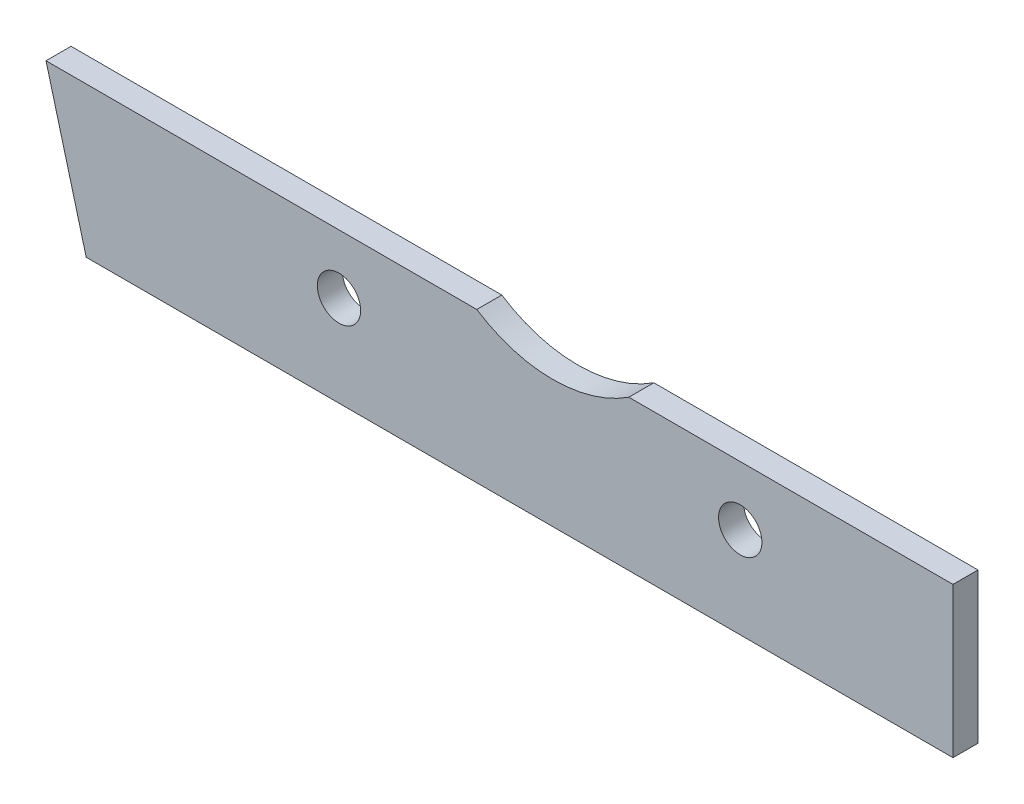
ISO-10303-21;
HEADER;
FILE_DESCRIPTION(('STEP AP214'),'2;1');
FILE_NAME('part.step','',(''),(''),'','','');
FILE_SCHEMA(('AUTOMOTIVE_DESIGN { 1 0 10303 214 1 1 1 1 }'));
ENDSEC;
DATA;
#1=APPLICATION_CONTEXT('core data for automotive mechanical design processes');
#2=APPLICATION_PROTOCOL_DEFINITION('international standard','automotive_design',2000,#1);
#3=PRODUCT_CONTEXT('',#1,'mechanical');
#4=PRODUCT('Part','Part','',(#3));
#5=PRODUCT_RELATED_PRODUCT_CATEGORY('part','',(#4));
#6=PRODUCT_DEFINITION_FORMATION('','',#4);
#7=PRODUCT_DEFINITION_CONTEXT('part definition',#1,'design');
#8=PRODUCT_DEFINITION('design','',#6,#7);
#9=PRODUCT_DEFINITION_SHAPE('','',#8);
#10=(LENGTH_UNIT() NAMED_UNIT(*) SI_UNIT(.MILLI.,.METRE.));
#11=(NAMED_UNIT(*) PLANE_ANGLE_UNIT() SI_UNIT($,.RADIAN.));
#12=(NAMED_UNIT(*) SI_UNIT($,.STERADIAN.) SOLID_ANGLE_UNIT());
#13=UNCERTAINTY_MEASURE_WITH_UNIT(LENGTH_MEASURE(1.E-05),#10,'distance_accuracy_value','');
#14=(GEOMETRIC_REPRESENTATION_CONTEXT(3) GLOBAL_UNCERTAINTY_ASSIGNED_CONTEXT((#13)) GLOBAL_UNIT_ASSIGNED_CONTEXT((#10,
#11,#12)) REPRESENTATION_CONTEXT('',''));
#15=CARTESIAN_POINT('',(0.,0.,0.));
#16=DIRECTION('',(0.,0.,1.));
#17=DIRECTION('',(1.,0.,0.));
#18=AXIS2_PLACEMENT_3D('',#15,#16,#17);
#19=CARTESIAN_POINT('',(-94.8284833684511,-355.15,-3.175));
#20=DIRECTION('',(1.,0.,0.));
#21=DIRECTION('',(0.,0.,-1.));
#22=AXIS2_PLACEMENT_3D('',#19,#20,#21);
#23=PLANE('',#22);
#24=DIRECTION('',(0.,1.,0.));
#25=VECTOR('',#24,1.);
#26=CARTESIAN_POINT('',(-94.8284833684511,-355.15,0.));
#27=LINE('',#26,#25);
#28=CARTESIAN_POINT('',(-94.8284833684511,-355.15,0.));
#29=VERTEX_POINT('',#28);
#30=CARTESIAN_POINT('',(-94.8284833684511,-336.1,0.));
#31=VERTEX_POINT('',#30);
#32=EDGE_CURVE('E133',#29,#31,#27,.T.);
#33=ORIENTED_EDGE('',*,*,#32,.F.);
#34=DIRECTION('',(0.,0.,1.));
#35=VECTOR('',#34,1.);
#36=CARTESIAN_POINT('',(-94.8284833684511,-355.15,-3.175));
#37=LINE('',#36,#35);
#38=CARTESIAN_POINT('',(-94.8284833684511,-355.15,-3.175));
#39=VERTEX_POINT('',#38);
#40=EDGE_CURVE('E11',#39,#29,#37,.T.);
#41=ORIENTED_EDGE('',*,*,#40,.F.);
#42=DIRECTION('',(0.,1.,0.));
#43=VECTOR('',#42,1.);
#44=CARTESIAN_POINT('',(-94.8284833684511,-355.15,-3.175));
#45=LINE('',#44,#43);
#46=CARTESIAN_POINT('',(-94.8284833684511,-336.1,-3.175));
#47=VERTEX_POINT('',#46);
#48=EDGE_CURVE('E154',#39,#47,#45,.T.);
#49=ORIENTED_EDGE('',*,*,#48,.T.);
#50=DIRECTION('',(0.,0.,1.));
#51=VECTOR('',#50,1.);
#52=CARTESIAN_POINT('',(-94.8284833684511,-336.1,-3.175));
#53=LINE('',#52,#51);
#54=EDGE_CURVE('E44',#47,#31,#53,.T.);
#55=ORIENTED_EDGE('',*,*,#54,.T.);
#56=EDGE_LOOP('',(#33,#41,#49,#55));
#57=FACE_BOUND('',#56,.T.);
#58=ADVANCED_FACE('F41',(#57),#23,.T.);
#59=CARTESIAN_POINT('',(-94.8284833684511,-355.15,-3.175));
#60=DIRECTION('',(0.,-1.,0.));
#61=DIRECTION('',(0.,0.,-1.));
#62=AXIS2_PLACEMENT_3D('',#59,#60,#61);
#63=PLANE('',#62);
#64=DIRECTION('',(1.,0.,0.));
#65=VECTOR('',#64,1.);
#66=CARTESIAN_POINT('',(-94.8284833684511,-355.15,0.));
#67=LINE('',#66,#65);
#68=CARTESIAN_POINT('',(-204.828483368451,-355.15,0.));
#69=VERTEX_POINT('',#68);
#70=EDGE_CURVE('E151',#69,#29,#67,.T.);
#71=ORIENTED_EDGE('',*,*,#70,.F.);
#72=DIRECTION('',(0.,0.,1.));
#73=VECTOR('',#72,1.);
#74=CARTESIAN_POINT('',(-204.828483368451,-355.15,-3.175));
#75=LINE('',#74,#73);
#76=CARTESIAN_POINT('',(-204.828483368451,-355.15,-3.175));
#77=VERTEX_POINT('',#76);
#78=EDGE_CURVE('E51',#77,#69,#75,.T.);
#79=ORIENTED_EDGE('',*,*,#78,.F.);
#80=DIRECTION('',(1.,0.,0.));
#81=VECTOR('',#80,1.);
#82=CARTESIAN_POINT('',(-94.8284833684511,-355.15,-3.175));
#83=LINE('',#82,#81);
#84=EDGE_CURVE('E118',#77,#39,#83,.T.);
#85=ORIENTED_EDGE('',*,*,#84,.T.);
#86=ORIENTED_EDGE('',*,*,#40,.T.);
#87=EDGE_LOOP('',(#71,#79,#85,#86));
#88=FACE_BOUND('',#87,.T.);
#89=ADVANCED_FACE('F168',(#88),#63,.T.);
#90=CARTESIAN_POINT('',(-204.828483368451,-355.15,-3.175));
#91=DIRECTION('',(-0.965925826289069,-0.258819045102518,0.));
#92=DIRECTION('',(0.258819045102518,-0.965925826289069,0.));
#93=AXIS2_PLACEMENT_3D('',#90,#91,#92);
#94=PLANE('',#93);
#95=DIRECTION('',(0.258819045102518,-0.965925826289069,0.));
#96=VECTOR('',#95,1.);
#97=CARTESIAN_POINT('',(-204.828483368451,-355.15,0.));
#98=LINE('',#97,#96);
#99=CARTESIAN_POINT('',(-209.932915484264,-336.1,0.));
#100=VERTEX_POINT('',#99);
#101=EDGE_CURVE('E104',#100,#69,#98,.T.);
#102=ORIENTED_EDGE('',*,*,#101,.F.);
#103=DIRECTION('',(0.,0.,1.));
#104=VECTOR('',#103,1.);
#105=CARTESIAN_POINT('',(-209.932915484264,-336.1,-3.175));
#106=LINE('',#105,#104);
#107=CARTESIAN_POINT('',(-209.932915484264,-336.1,-3.175));
#108=VERTEX_POINT('',#107);
#109=EDGE_CURVE('E99',#108,#100,#106,.T.);
#110=ORIENTED_EDGE('',*,*,#109,.F.);
#111=DIRECTION('',(0.258819045102518,-0.965925826289069,0.));
#112=VECTOR('',#111,1.);
#113=CARTESIAN_POINT('',(-204.828483368451,-355.15,-3.175));
#114=LINE('',#113,#112);
#115=EDGE_CURVE('E102',#108,#77,#114,.T.);
#116=ORIENTED_EDGE('',*,*,#115,.T.);
#117=ORIENTED_EDGE('',*,*,#78,.T.);
#118=EDGE_LOOP('',(#102,#110,#116,#117));
#119=FACE_BOUND('',#118,.T.);
#120=ADVANCED_FACE('F101',(#119),#94,.T.);
#121=CARTESIAN_POINT('',(-155.261017178421,-336.1,-3.175));
#122=DIRECTION('',(0.,1.,0.));
#123=DIRECTION('',(0.,0.,1.));
#124=AXIS2_PLACEMENT_3D('',#121,#122,#123);
#125=PLANE('',#124);
#126=DIRECTION('',(-1.,0.,0.));
#127=VECTOR('',#126,1.);
#128=CARTESIAN_POINT('',(-155.261017178421,-336.1,0.));
#129=LINE('',#128,#127);
#130=CARTESIAN_POINT('',(-155.261017178421,-336.1,0.));
#131=VERTEX_POINT('',#130);
#132=EDGE_CURVE('E146',#131,#100,#129,.T.);
#133=ORIENTED_EDGE('',*,*,#132,.F.);
#134=DIRECTION('',(0.,0.,1.));
#135=VECTOR('',#134,1.);
#136=CARTESIAN_POINT('',(-155.261017178421,-336.1,-3.175));
#137=LINE('',#136,#135);
#138=CARTESIAN_POINT('',(-155.261017178421,-336.1,-3.175));
#139=VERTEX_POINT('',#138);
#140=EDGE_CURVE('E110',#139,#131,#137,.T.);
#141=ORIENTED_EDGE('',*,*,#140,.F.);
#142=DIRECTION('',(-1.,0.,0.));
#143=VECTOR('',#142,1.);
#144=CARTESIAN_POINT('',(-155.261017178421,-336.1,-3.175));
#145=LINE('',#144,#143);
#146=EDGE_CURVE('E116',#139,#108,#145,.T.);
#147=ORIENTED_EDGE('',*,*,#146,.T.);
#148=ORIENTED_EDGE('',*,*,#109,.T.);
#149=EDGE_LOOP('',(#133,#141,#147,#148));
#150=FACE_BOUND('',#149,.T.);
#151=ADVANCED_FACE('F121',(#150),#125,.T.);
#152=CARTESIAN_POINT('',(-145.615191064405,-321.335543463161,-3.175));
#153=DIRECTION('',(0.,0.,1.));
#154=DIRECTION('',(1.,0.,0.));
#155=AXIS2_PLACEMENT_3D('',#152,#153,#154);
#156=CYLINDRICAL_SURFACE('',#155,17.6360749105362);
#157=CARTESIAN_POINT('',(-145.615191064405,-321.335543463161,0.));
#158=DIRECTION('',(0.,0.,-1.));
#159=DIRECTION('',(-1.,0.,0.));
#160=AXIS2_PLACEMENT_3D('',#157,#158,#159);
#161=CIRCLE('',#160,17.6360749105362);
#162=CARTESIAN_POINT('',(-135.969364950389,-336.1,0.));
#163=VERTEX_POINT('',#162);
#164=EDGE_CURVE('E142',#163,#131,#161,.T.);
#165=ORIENTED_EDGE('',*,*,#164,.F.);
#166=DIRECTION('',(0.,0.,1.));
#167=VECTOR('',#166,1.);
#168=CARTESIAN_POINT('',(-135.969364950389,-336.1,-3.175));
#169=LINE('',#168,#167);
#170=CARTESIAN_POINT('',(-135.969364950389,-336.1,-3.175));
#171=VERTEX_POINT('',#170);
#172=EDGE_CURVE('E159',#171,#163,#169,.T.);
#173=ORIENTED_EDGE('',*,*,#172,.F.);
#174=CARTESIAN_POINT('',(-145.615191064405,-321.335543463161,-3.175));
#175=DIRECTION('',(0.,0.,-1.));
#176=DIRECTION('',(-1.,0.,0.));
#177=AXIS2_PLACEMENT_3D('',#174,#175,#176);
#178=CIRCLE('',#177,17.6360749105362);
#179=EDGE_CURVE('E123',#171,#139,#178,.T.);
#180=ORIENTED_EDGE('',*,*,#179,.T.);
#181=ORIENTED_EDGE('',*,*,#140,.T.);
#182=EDGE_LOOP('',(#165,#173,#180,#181));
#183=FACE_BOUND('',#182,.T.);
#184=ADVANCED_FACE('F181',(#183),#156,.F.);
#185=CARTESIAN_POINT('',(-94.8284833684511,-336.1,-3.175));
#186=DIRECTION('',(0.,1.,0.));
#187=DIRECTION('',(0.,0.,1.));
#188=AXIS2_PLACEMENT_3D('',#185,#186,#187);
#189=PLANE('',#188);
#190=DIRECTION('',(-1.,0.,0.));
#191=VECTOR('',#190,1.);
#192=CARTESIAN_POINT('',(-94.8284833684511,-336.1,0.));
#193=LINE('',#192,#191);
#194=EDGE_CURVE('E137',#31,#163,#193,.T.);
#195=ORIENTED_EDGE('',*,*,#194,.F.);
#196=ORIENTED_EDGE('',*,*,#54,.F.);
#197=DIRECTION('',(-1.,0.,0.));
#198=VECTOR('',#197,1.);
#199=CARTESIAN_POINT('',(-94.8284833684511,-336.1,-3.175));
#200=LINE('',#199,#198);
#201=EDGE_CURVE('E127',#47,#171,#200,.T.);
#202=ORIENTED_EDGE('',*,*,#201,.T.);
#203=ORIENTED_EDGE('',*,*,#172,.T.);
#204=EDGE_LOOP('',(#195,#196,#202,#203));
#205=FACE_BOUND('',#204,.T.);
#206=ADVANCED_FACE('F165',(#205),#189,.T.);
#207=CARTESIAN_POINT('',(-145.615191064405,-321.335543463161,-3.175));
#208=DIRECTION('',(0.,0.,-1.));
#209=DIRECTION('',(-1.,0.,0.));
#210=AXIS2_PLACEMENT_3D('',#207,#208,#209);
#211=PLANE('',#210);
#212=CARTESIAN_POINT('',(-172.748438952013,-343.6,-3.175));
#213=DIRECTION('',(0.,0.,1.));
#214=DIRECTION('',(1.,0.,0.));
#215=AXIS2_PLACEMENT_3D('',#212,#213,#214);
#216=CIRCLE('',#215,2.75000000000001);
#217=CARTESIAN_POINT('',(-169.998438952013,-343.6,-3.175));
#218=VERTEX_POINT('',#217);
#219=EDGE_CURVE('E207',#218,#218,#216,.T.);
#220=ORIENTED_EDGE('',*,*,#219,.T.);
#221=EDGE_LOOP('',(#220));
#222=FACE_BOUND('',#221,.T.);
#223=CARTESIAN_POINT('',(-121.828483368451,-343.6,-3.175));
#224=DIRECTION('',(0.,0.,1.));
#225=DIRECTION('',(1.,0.,0.));
#226=AXIS2_PLACEMENT_3D('',#223,#224,#225);
#227=CIRCLE('',#226,2.75000000000001);
#228=CARTESIAN_POINT('',(-119.078483368451,-343.6,-3.175));
#229=VERTEX_POINT('',#228);
#230=EDGE_CURVE('E138',#229,#229,#227,.T.);
#231=ORIENTED_EDGE('',*,*,#230,.T.);
#232=EDGE_LOOP('',(#231));
#233=FACE_BOUND('',#232,.T.);
#234=ORIENTED_EDGE('',*,*,#48,.F.);
#235=ORIENTED_EDGE('',*,*,#84,.F.);
#236=ORIENTED_EDGE('',*,*,#115,.F.);
#237=ORIENTED_EDGE('',*,*,#146,.F.);
#238=ORIENTED_EDGE('',*,*,#179,.F.);
#239=ORIENTED_EDGE('',*,*,#201,.F.);
#240=EDGE_LOOP('',(#234,#235,#236,#237,#238,#239));
#241=FACE_BOUND('',#240,.T.);
#242=ADVANCED_FACE('F114',(#222,#233,#241),#211,.T.);
#243=CARTESIAN_POINT('',(-145.615191064405,-321.335543463161,0.));
#244=DIRECTION('',(0.,0.,-1.));
#245=DIRECTION('',(-1.,0.,0.));
#246=AXIS2_PLACEMENT_3D('',#243,#244,#245);
#247=PLANE('',#246);
#248=CARTESIAN_POINT('',(-172.748438952013,-343.6,0.));
#249=DIRECTION('',(0.,0.,1.));
#250=DIRECTION('',(1.,0.,0.));
#251=AXIS2_PLACEMENT_3D('',#248,#249,#250);
#252=CIRCLE('',#251,2.75000000000001);
#253=CARTESIAN_POINT('',(-169.998438952013,-343.6,0.));
#254=VERTEX_POINT('',#253);
#255=EDGE_CURVE('E210',#254,#254,#252,.T.);
#256=ORIENTED_EDGE('',*,*,#255,.F.);
#257=EDGE_LOOP('',(#256));
#258=FACE_BOUND('',#257,.T.);
#259=CARTESIAN_POINT('',(-121.828483368451,-343.6,0.));
#260=DIRECTION('',(0.,0.,1.));
#261=DIRECTION('',(1.,0.,0.));
#262=AXIS2_PLACEMENT_3D('',#259,#260,#261);
#263=CIRCLE('',#262,2.75000000000001);
#264=CARTESIAN_POINT('',(-119.078483368451,-343.6,0.));
#265=VERTEX_POINT('',#264);
#266=EDGE_CURVE('E215',#265,#265,#263,.T.);
#267=ORIENTED_EDGE('',*,*,#266,.F.);
#268=EDGE_LOOP('',(#267));
#269=FACE_BOUND('',#268,.T.);
#270=ORIENTED_EDGE('',*,*,#32,.T.);
#271=ORIENTED_EDGE('',*,*,#194,.T.);
#272=ORIENTED_EDGE('',*,*,#164,.T.);
#273=ORIENTED_EDGE('',*,*,#132,.T.);
#274=ORIENTED_EDGE('',*,*,#101,.T.);
#275=ORIENTED_EDGE('',*,*,#70,.T.);
#276=EDGE_LOOP('',(#270,#271,#272,#273,#274,#275));
#277=FACE_BOUND('',#276,.T.);
#278=ADVANCED_FACE('F167',(#258,#269,#277),#247,.F.);
#279=CARTESIAN_POINT('',(-121.828483368451,-343.6,-3.175));
#280=DIRECTION('',(0.,0.,1.));
#281=DIRECTION('',(1.,0.,0.));
#282=AXIS2_PLACEMENT_3D('',#279,#280,#281);
#283=CYLINDRICAL_SURFACE('',#282,2.75000000000001);
#284=ORIENTED_EDGE('',*,*,#230,.F.);
#285=EDGE_LOOP('',(#284));
#286=FACE_BOUND('',#285,.T.);
#287=ORIENTED_EDGE('',*,*,#266,.T.);
#288=EDGE_LOOP('',(#287));
#289=FACE_BOUND('',#288,.T.);
#290=ADVANCED_FACE('F192',(#286,#289),#283,.F.);
#291=CARTESIAN_POINT('',(-172.748438952013,-343.6,-3.175));
#292=DIRECTION('',(0.,0.,1.));
#293=DIRECTION('',(1.,0.,0.));
#294=AXIS2_PLACEMENT_3D('',#291,#292,#293);
#295=CYLINDRICAL_SURFACE('',#294,2.75000000000001);
#296=ORIENTED_EDGE('',*,*,#219,.F.);
#297=EDGE_LOOP('',(#296));
#298=FACE_BOUND('',#297,.T.);
#299=ORIENTED_EDGE('',*,*,#255,.T.);
#300=EDGE_LOOP('',(#299));
#301=FACE_BOUND('',#300,.T.);
#302=ADVANCED_FACE('F199',(#298,#301),#295,.F.);
#303=CLOSED_SHELL('',(#58,#89,#120,#151,#184,#206,#242,#278,#290,#302));
#304=MANIFOLD_SOLID_BREP('B2',#303);
#305=ADVANCED_BREP_SHAPE_REPRESENTATION('',(#18,#304),#14);
#306=SHAPE_DEFINITION_REPRESENTATION(#9,#305);
ENDSEC;
END-ISO-10303-21;
